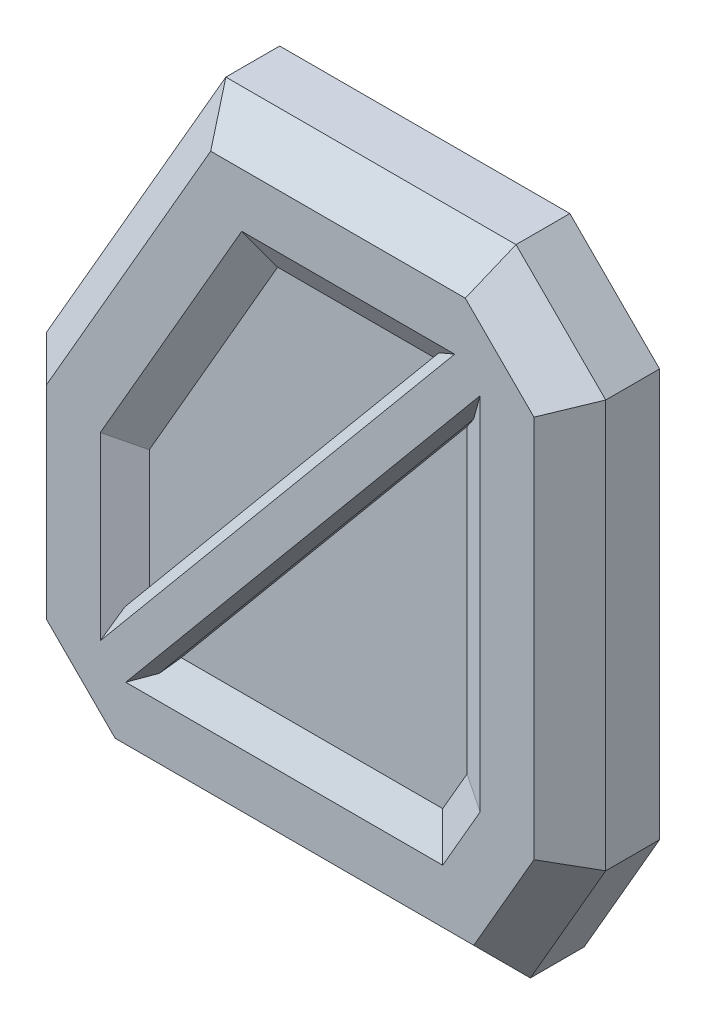
ISO-10303-21;
HEADER;
FILE_DESCRIPTION(('STEP AP214'),'2;1');
FILE_NAME('part.step','',(''),(''),'','','');
FILE_SCHEMA(('AUTOMOTIVE_DESIGN { 1 0 10303 214 1 1 1 1 }'));
ENDSEC;
DATA;
#1=APPLICATION_CONTEXT('core data for automotive mechanical design processes');
#2=APPLICATION_PROTOCOL_DEFINITION('international standard','automotive_design',2000,#1);
#3=PRODUCT_CONTEXT('',#1,'mechanical');
#4=PRODUCT('Part','Part','',(#3));
#5=PRODUCT_RELATED_PRODUCT_CATEGORY('part','',(#4));
#6=PRODUCT_DEFINITION_FORMATION('','',#4);
#7=PRODUCT_DEFINITION_CONTEXT('part definition',#1,'design');
#8=PRODUCT_DEFINITION('design','',#6,#7);
#9=PRODUCT_DEFINITION_SHAPE('','',#8);
#10=(LENGTH_UNIT() NAMED_UNIT(*) SI_UNIT(.MILLI.,.METRE.));
#11=(NAMED_UNIT(*) PLANE_ANGLE_UNIT() SI_UNIT($,.RADIAN.));
#12=(NAMED_UNIT(*) SI_UNIT($,.STERADIAN.) SOLID_ANGLE_UNIT());
#13=UNCERTAINTY_MEASURE_WITH_UNIT(LENGTH_MEASURE(1.E-05),#10,'distance_accuracy_value','');
#14=(GEOMETRIC_REPRESENTATION_CONTEXT(3) GLOBAL_UNCERTAINTY_ASSIGNED_CONTEXT((#13)) GLOBAL_UNIT_ASSIGNED_CONTEXT((#10,
#11,#12)) REPRESENTATION_CONTEXT('',''));
#15=CARTESIAN_POINT('',(0.,0.,0.));
#16=DIRECTION('',(0.,0.,1.));
#17=DIRECTION('',(1.,0.,0.));
#18=AXIS2_PLACEMENT_3D('',#15,#16,#17);
#19=CARTESIAN_POINT('',(0.,0.,0.));
#20=DIRECTION('',(0.,0.,1.));
#21=DIRECTION('',(1.,0.,0.));
#22=AXIS2_PLACEMENT_3D('',#19,#20,#21);
#23=PLANE('',#22);
#24=DIRECTION('',(-0.707106781186548,0.707106781186547,0.));
#25=VECTOR('',#24,1.);
#26=CARTESIAN_POINT('',(319.726027397261,-1.22254998857188E-13,0.));
#27=LINE('',#26,#25);
#28=CARTESIAN_POINT('',(319.726027397261,-1.22254998857188E-13,0.));
#29=VERTEX_POINT('',#28);
#30=CARTESIAN_POINT('',(269.72602739726,50.0000000000003,0.));
#31=VERTEX_POINT('',#30);
#32=EDGE_CURVE('E241',#29,#31,#27,.T.);
#33=ORIENTED_EDGE('',*,*,#32,.T.);
#34=DIRECTION('',(0.,1.,0.));
#35=VECTOR('',#34,1.);
#36=CARTESIAN_POINT('',(269.72602739726,-1.0547118733939E-12,0.));
#37=LINE('',#36,#35);
#38=CARTESIAN_POINT('',(269.72602739726,176.794919243112,0.));
#39=VERTEX_POINT('',#38);
#40=EDGE_CURVE('E230',#31,#39,#37,.T.);
#41=ORIENTED_EDGE('',*,*,#40,.T.);
#42=DIRECTION('',(0.500000000000001,0.866025403784438,0.));
#43=VECTOR('',#42,1.);
#44=CARTESIAN_POINT('',(269.72602739726,176.794919243112,0.));
#45=LINE('',#44,#43);
#46=CARTESIAN_POINT('',(369.726027397261,350.,0.));
#47=VERTEX_POINT('',#46);
#48=EDGE_CURVE('E248',#39,#47,#45,.T.);
#49=ORIENTED_EDGE('',*,*,#48,.T.);
#50=DIRECTION('',(1.,0.,0.));
#51=VECTOR('',#50,1.);
#52=CARTESIAN_POINT('',(369.726027397261,350.,0.));
#53=LINE('',#52,#51);
#54=CARTESIAN_POINT('',(531.452054794521,350.,0.));
#55=VERTEX_POINT('',#54);
#56=EDGE_CURVE('E410',#47,#55,#53,.T.);
#57=ORIENTED_EDGE('',*,*,#56,.T.);
#58=DIRECTION('',(0.707106781186547,-0.707106781186549,0.));
#59=VECTOR('',#58,1.);
#60=CARTESIAN_POINT('',(531.452054794521,350.,0.));
#61=LINE('',#60,#59);
#62=CARTESIAN_POINT('',(581.452054794521,299.999999999999,0.));
#63=VERTEX_POINT('',#62);
#64=EDGE_CURVE('E413',#55,#63,#61,.T.);
#65=ORIENTED_EDGE('',*,*,#64,.T.);
#66=DIRECTION('',(0.,-1.,0.));
#67=VECTOR('',#66,1.);
#68=CARTESIAN_POINT('',(581.452054794521,299.999999999999,0.));
#69=LINE('',#68,#67);
#70=CARTESIAN_POINT('',(581.452054794521,72.7461339178923,0.));
#71=VERTEX_POINT('',#70);
#72=EDGE_CURVE('E416',#63,#71,#69,.T.);
#73=ORIENTED_EDGE('',*,*,#72,.T.);
#74=DIRECTION('',(-0.500000000000002,-0.866025403784438,0.));
#75=VECTOR('',#74,1.);
#76=CARTESIAN_POINT('',(581.452054794521,72.7461339178923,0.));
#77=LINE('',#76,#75);
#78=CARTESIAN_POINT('',(539.45205479452,-4.72315937815432E-13,0.));
#79=VERTEX_POINT('',#78);
#80=EDGE_CURVE('E329',#71,#79,#77,.T.);
#81=ORIENTED_EDGE('',*,*,#80,.T.);
#82=DIRECTION('',(-1.,0.,0.));
#83=VECTOR('',#82,1.);
#84=CARTESIAN_POINT('',(539.45205479452,-4.72315937815432E-13,0.));
#85=LINE('',#84,#83);
#86=EDGE_CURVE('E244',#79,#29,#85,.T.);
#87=ORIENTED_EDGE('',*,*,#86,.T.);
#88=EDGE_LOOP('',(#33,#41,#49,#57,#65,#73,#81,#87));
#89=FACE_BOUND('',#88,.T.);
#90=DIRECTION('',(0.500000000000002,0.866025403784438,0.));
#91=VECTOR('',#90,1.);
#92=CARTESIAN_POINT('',(533.678552102624,9.99999999999954,0.));
#93=LINE('',#92,#91);
#94=CARTESIAN_POINT('',(533.678552102624,9.99999999999954,0.));
#95=VERTEX_POINT('',#94);
#96=CARTESIAN_POINT('',(571.452054794521,75.4256258422035,0.));
#97=VERTEX_POINT('',#96);
#98=EDGE_CURVE('E620',#95,#97,#93,.T.);
#99=ORIENTED_EDGE('',*,*,#98,.T.);
#100=DIRECTION('',(0.,1.,0.));
#101=VECTOR('',#100,1.);
#102=CARTESIAN_POINT('',(571.452054794521,75.4256258422035,0.));
#103=LINE('',#102,#101);
#104=CARTESIAN_POINT('',(571.452054794521,295.857864376268,0.));
#105=VERTEX_POINT('',#104);
#106=EDGE_CURVE('E617',#97,#105,#103,.T.);
#107=ORIENTED_EDGE('',*,*,#106,.T.);
#108=DIRECTION('',(-0.707106781186546,0.707106781186549,0.));
#109=VECTOR('',#108,1.);
#110=CARTESIAN_POINT('',(571.452054794521,295.857864376268,0.));
#111=LINE('',#110,#109);
#112=CARTESIAN_POINT('',(527.30991917079,340.,0.));
#113=VERTEX_POINT('',#112);
#114=EDGE_CURVE('E614',#105,#113,#111,.T.);
#115=ORIENTED_EDGE('',*,*,#114,.T.);
#116=DIRECTION('',(-1.,0.,0.));
#117=VECTOR('',#116,1.);
#118=CARTESIAN_POINT('',(527.30991917079,340.,0.));
#119=LINE('',#118,#117);
#120=CARTESIAN_POINT('',(375.499530089157,340.,0.));
#121=VERTEX_POINT('',#120);
#122=EDGE_CURVE('E611',#113,#121,#119,.T.);
#123=ORIENTED_EDGE('',*,*,#122,.T.);
#124=DIRECTION('',(-0.500000000000001,-0.866025403784438,0.));
#125=VECTOR('',#124,1.);
#126=CARTESIAN_POINT('',(375.499530089157,340.,0.));
#127=LINE('',#126,#125);
#128=CARTESIAN_POINT('',(279.72602739726,174.1154273188,0.));
#129=VERTEX_POINT('',#128);
#130=EDGE_CURVE('E608',#121,#129,#127,.T.);
#131=ORIENTED_EDGE('',*,*,#130,.T.);
#132=DIRECTION('',(0.,-1.,0.));
#133=VECTOR('',#132,1.);
#134=CARTESIAN_POINT('',(279.72602739726,174.1154273188,0.));
#135=LINE('',#134,#133);
#136=CARTESIAN_POINT('',(279.72602739726,54.1421356237311,0.));
#137=VERTEX_POINT('',#136);
#138=EDGE_CURVE('E605',#129,#137,#135,.T.);
#139=ORIENTED_EDGE('',*,*,#138,.T.);
#140=DIRECTION('',(0.707106781186548,-0.707106781186548,0.));
#141=VECTOR('',#140,1.);
#142=CARTESIAN_POINT('',(279.72602739726,54.1421356237311,0.));
#143=LINE('',#142,#141);
#144=CARTESIAN_POINT('',(323.868163020991,9.99999999999987,0.));
#145=VERTEX_POINT('',#144);
#146=EDGE_CURVE('E601',#137,#145,#143,.T.);
#147=ORIENTED_EDGE('',*,*,#146,.T.);
#148=DIRECTION('',(1.,0.,0.));
#149=VECTOR('',#148,1.);
#150=CARTESIAN_POINT('',(323.868163020991,9.99999999999987,0.));
#151=LINE('',#150,#149);
#152=EDGE_CURVE('E238',#145,#95,#151,.T.);
#153=ORIENTED_EDGE('',*,*,#152,.T.);
#154=EDGE_LOOP('',(#99,#107,#115,#123,#131,#139,#147,#153));
#155=FACE_BOUND('',#154,.T.);
#156=ADVANCED_FACE('F35',(#89,#155),#23,.F.);
#157=CARTESIAN_POINT('',(581.452054794521,72.7461339178923,50.));
#158=DIRECTION('',(-0.866025403784438,0.500000000000002,0.));
#159=DIRECTION('',(0.500000000000002,0.866025403784438,0.));
#160=AXIS2_PLACEMENT_3D('',#157,#158,#159);
#161=PLANE('',#160);
#162=DIRECTION('',(0.,0.,-1.));
#163=VECTOR('',#162,1.);
#164=CARTESIAN_POINT('',(539.45205479452,-4.72315937815432E-13,50.));
#165=LINE('',#164,#163);
#166=CARTESIAN_POINT('',(539.45205479452,-4.72315937815432E-13,29.9999999999999));
#167=VERTEX_POINT('',#166);
#168=EDGE_CURVE('E256',#167,#79,#165,.T.);
#169=ORIENTED_EDGE('',*,*,#168,.T.);
#170=ORIENTED_EDGE('',*,*,#80,.F.);
#171=DIRECTION('',(0.,0.,-1.));
#172=VECTOR('',#171,1.);
#173=CARTESIAN_POINT('',(581.452054794521,72.7461339178923,50.));
#174=LINE('',#173,#172);
#175=CARTESIAN_POINT('',(581.452054794521,72.7461339178923,29.9999999999999));
#176=VERTEX_POINT('',#175);
#177=EDGE_CURVE('E418',#176,#71,#174,.T.);
#178=ORIENTED_EDGE('',*,*,#177,.F.);
#179=DIRECTION('',(0.500000000000002,0.866025403784438,0.));
#180=VECTOR('',#179,1.);
#181=CARTESIAN_POINT('',(581.452054794521,72.7461339178923,29.9999999999999));
#182=LINE('',#181,#180);
#183=EDGE_CURVE('E307',#167,#176,#182,.T.);
#184=ORIENTED_EDGE('',*,*,#183,.F.);
#185=EDGE_LOOP('',(#169,#170,#178,#184));
#186=FACE_BOUND('',#185,.T.);
#187=ADVANCED_FACE('F446',(#186),#161,.F.);
#188=CARTESIAN_POINT('',(539.45205479452,-4.72315937815432E-13,50.));
#189=DIRECTION('',(0.,1.,0.));
#190=DIRECTION('',(1.,0.,0.));
#191=AXIS2_PLACEMENT_3D('',#188,#189,#190);
#192=PLANE('',#191);
#193=DIRECTION('',(0.,0.,-1.));
#194=VECTOR('',#193,1.);
#195=CARTESIAN_POINT('',(319.726027397261,-1.22254998857188E-13,50.));
#196=LINE('',#195,#194);
#197=CARTESIAN_POINT('',(319.726027397261,-1.22254998857188E-13,29.9999999999999));
#198=VERTEX_POINT('',#197);
#199=EDGE_CURVE('E254',#198,#29,#196,.T.);
#200=ORIENTED_EDGE('',*,*,#199,.T.);
#201=ORIENTED_EDGE('',*,*,#86,.F.);
#202=ORIENTED_EDGE('',*,*,#168,.F.);
#203=DIRECTION('',(1.,0.,0.));
#204=VECTOR('',#203,1.);
#205=CARTESIAN_POINT('',(539.45205479452,-4.72315937815432E-13,29.9999999999999));
#206=LINE('',#205,#204);
#207=EDGE_CURVE('E304',#198,#167,#206,.T.);
#208=ORIENTED_EDGE('',*,*,#207,.F.);
#209=EDGE_LOOP('',(#200,#201,#202,#208));
#210=FACE_BOUND('',#209,.T.);
#211=ADVANCED_FACE('F450',(#210),#192,.F.);
#212=CARTESIAN_POINT('',(319.726027397261,-1.22254998857188E-13,50.));
#213=DIRECTION('',(0.707106781186547,0.707106781186548,0.));
#214=DIRECTION('',(0.707106781186548,-0.707106781186547,0.));
#215=AXIS2_PLACEMENT_3D('',#212,#213,#214);
#216=PLANE('',#215);
#217=DIRECTION('',(0.,0.,-1.));
#218=VECTOR('',#217,1.);
#219=CARTESIAN_POINT('',(269.72602739726,50.0000000000001,50.));
#220=LINE('',#219,#218);
#221=CARTESIAN_POINT('',(269.72602739726,50.0000000000001,29.9999999999999));
#222=VERTEX_POINT('',#221);
#223=EDGE_CURVE('E49',#222,#31,#220,.T.);
#224=ORIENTED_EDGE('',*,*,#223,.T.);
#225=ORIENTED_EDGE('',*,*,#32,.F.);
#226=ORIENTED_EDGE('',*,*,#199,.F.);
#227=DIRECTION('',(0.707106781186548,-0.707106781186547,0.));
#228=VECTOR('',#227,1.);
#229=CARTESIAN_POINT('',(319.726027397261,-1.21387637119199E-13,29.9999999999999));
#230=LINE('',#229,#228);
#231=EDGE_CURVE('E253',#222,#198,#230,.T.);
#232=ORIENTED_EDGE('',*,*,#231,.F.);
#233=EDGE_LOOP('',(#224,#225,#226,#232));
#234=FACE_BOUND('',#233,.T.);
#235=ADVANCED_FACE('F251',(#234),#216,.F.);
#236=CARTESIAN_POINT('',(269.72602739726,176.794919243112,50.));
#237=DIRECTION('',(0.866025403784438,-0.500000000000001,0.));
#238=DIRECTION('',(-0.500000000000001,-0.866025403784438,0.));
#239=AXIS2_PLACEMENT_3D('',#236,#237,#238);
#240=PLANE('',#239);
#241=DIRECTION('',(0.,0.,-1.));
#242=VECTOR('',#241,1.);
#243=CARTESIAN_POINT('',(369.726027397261,350.,50.));
#244=LINE('',#243,#242);
#245=CARTESIAN_POINT('',(369.726027397261,350.,29.9999999999999));
#246=VERTEX_POINT('',#245);
#247=EDGE_CURVE('E258',#246,#47,#244,.T.);
#248=ORIENTED_EDGE('',*,*,#247,.T.);
#249=ORIENTED_EDGE('',*,*,#48,.F.);
#250=DIRECTION('',(0.,0.,-1.));
#251=VECTOR('',#250,1.);
#252=CARTESIAN_POINT('',(269.72602739726,176.794919243112,50.));
#253=LINE('',#252,#251);
#254=CARTESIAN_POINT('',(269.72602739726,176.794919243112,29.9999999999999));
#255=VERTEX_POINT('',#254);
#256=EDGE_CURVE('E234',#255,#39,#253,.T.);
#257=ORIENTED_EDGE('',*,*,#256,.F.);
#258=DIRECTION('',(-0.500000000000001,-0.866025403784438,0.));
#259=VECTOR('',#258,1.);
#260=CARTESIAN_POINT('',(269.72602739726,176.794919243112,29.9999999999999));
#261=LINE('',#260,#259);
#262=EDGE_CURVE('E297',#246,#255,#261,.T.);
#263=ORIENTED_EDGE('',*,*,#262,.F.);
#264=EDGE_LOOP('',(#248,#249,#257,#263));
#265=FACE_BOUND('',#264,.T.);
#266=ADVANCED_FACE('F430',(#265),#240,.F.);
#267=CARTESIAN_POINT('',(369.726027397261,350.,50.));
#268=DIRECTION('',(0.,-1.,0.));
#269=DIRECTION('',(0.,0.,-1.));
#270=AXIS2_PLACEMENT_3D('',#267,#268,#269);
#271=PLANE('',#270);
#272=DIRECTION('',(0.,0.,-1.));
#273=VECTOR('',#272,1.);
#274=CARTESIAN_POINT('',(531.452054794521,350.,50.));
#275=LINE('',#274,#273);
#276=CARTESIAN_POINT('',(531.452054794521,350.,29.9999999999999));
#277=VERTEX_POINT('',#276);
#278=EDGE_CURVE('E424',#277,#55,#275,.T.);
#279=ORIENTED_EDGE('',*,*,#278,.T.);
#280=ORIENTED_EDGE('',*,*,#56,.F.);
#281=ORIENTED_EDGE('',*,*,#247,.F.);
#282=DIRECTION('',(-1.,0.,0.));
#283=VECTOR('',#282,1.);
#284=CARTESIAN_POINT('',(369.726027397261,350.,29.9999999999999));
#285=LINE('',#284,#283);
#286=EDGE_CURVE('E294',#277,#246,#285,.T.);
#287=ORIENTED_EDGE('',*,*,#286,.F.);
#288=EDGE_LOOP('',(#279,#280,#281,#287));
#289=FACE_BOUND('',#288,.T.);
#290=ADVANCED_FACE('F433',(#289),#271,.F.);
#291=CARTESIAN_POINT('',(531.452054794521,350.,50.));
#292=DIRECTION('',(-0.707106781186549,-0.707106781186547,0.));
#293=DIRECTION('',(-0.707106781186547,0.707106781186549,0.));
#294=AXIS2_PLACEMENT_3D('',#291,#292,#293);
#295=PLANE('',#294);
#296=DIRECTION('',(0.,0.,-1.));
#297=VECTOR('',#296,1.);
#298=CARTESIAN_POINT('',(581.452054794521,299.999999999999,50.));
#299=LINE('',#298,#297);
#300=CARTESIAN_POINT('',(581.452054794521,299.999999999999,29.9999999999999));
#301=VERTEX_POINT('',#300);
#302=EDGE_CURVE('E421',#301,#63,#299,.T.);
#303=ORIENTED_EDGE('',*,*,#302,.T.);
#304=ORIENTED_EDGE('',*,*,#64,.F.);
#305=ORIENTED_EDGE('',*,*,#278,.F.);
#306=DIRECTION('',(-0.707106781186547,0.707106781186549,0.));
#307=VECTOR('',#306,1.);
#308=CARTESIAN_POINT('',(531.452054794521,350.,29.9999999999999));
#309=LINE('',#308,#307);
#310=EDGE_CURVE('E291',#301,#277,#309,.T.);
#311=ORIENTED_EDGE('',*,*,#310,.F.);
#312=EDGE_LOOP('',(#303,#304,#305,#311));
#313=FACE_BOUND('',#312,.T.);
#314=ADVANCED_FACE('F438',(#313),#295,.F.);
#315=CARTESIAN_POINT('',(581.452054794521,299.999999999999,50.));
#316=DIRECTION('',(-1.,0.,0.));
#317=DIRECTION('',(0.,0.,-1.));
#318=AXIS2_PLACEMENT_3D('',#315,#316,#317);
#319=PLANE('',#318);
#320=ORIENTED_EDGE('',*,*,#177,.T.);
#321=ORIENTED_EDGE('',*,*,#72,.F.);
#322=ORIENTED_EDGE('',*,*,#302,.F.);
#323=DIRECTION('',(0.,1.,0.));
#324=VECTOR('',#323,1.);
#325=CARTESIAN_POINT('',(581.452054794521,299.999999999999,29.9999999999999));
#326=LINE('',#325,#324);
#327=EDGE_CURVE('E288',#176,#301,#326,.T.);
#328=ORIENTED_EDGE('',*,*,#327,.F.);
#329=EDGE_LOOP('',(#320,#321,#322,#328));
#330=FACE_BOUND('',#329,.T.);
#331=ADVANCED_FACE('F441',(#330),#319,.F.);
#332=CARTESIAN_POINT('',(539.45205479452,-4.72347074700917E-13,50.));
#333=DIRECTION('',(0.,0.,1.));
#334=DIRECTION('',(-1.,0.,0.));
#335=AXIS2_PLACEMENT_3D('',#332,#333,#334);
#336=PLANE('',#335);
#337=DIRECTION('',(0.,-1.,0.));
#338=VECTOR('',#337,1.);
#339=CARTESIAN_POINT('',(531.452054794521,279.289321881345,50.));
#340=LINE('',#339,#338);
#341=CARTESIAN_POINT('',(531.452054794521,287.100997423057,50.));
#342=VERTEX_POINT('',#341);
#343=CARTESIAN_POINT('',(531.452054794521,86.1435935394485,50.));
#344=VERTEX_POINT('',#343);
#345=EDGE_CURVE('E363',#342,#344,#340,.T.);
#346=ORIENTED_EDGE('',*,*,#345,.T.);
#347=DIRECTION('',(-0.500000000000002,-0.866025403784438,0.));
#348=VECTOR('',#347,1.);
#349=CARTESIAN_POINT('',(531.452054794521,86.1435935394485,50.));
#350=LINE('',#349,#348);
#351=CARTESIAN_POINT('',(510.584541335039,49.9999999999996,50.));
#352=VERTEX_POINT('',#351);
#353=EDGE_CURVE('E580',#344,#352,#350,.T.);
#354=ORIENTED_EDGE('',*,*,#353,.T.);
#355=DIRECTION('',(-1.,0.,0.));
#356=VECTOR('',#355,1.);
#357=CARTESIAN_POINT('',(510.584541335039,49.9999999999996,50.));
#358=LINE('',#357,#356);
#359=CARTESIAN_POINT('',(333.928988890439,49.9999999999998,50.));
#360=VERTEX_POINT('',#359);
#361=EDGE_CURVE('E577',#352,#360,#358,.T.);
#362=ORIENTED_EDGE('',*,*,#361,.T.);
#363=DIRECTION('',(-0.640067546751165,-0.768318641968257,0.));
#364=VECTOR('',#363,1.);
#365=CARTESIAN_POINT('',(336.595112306074,53.2003377337557,50.));
#366=LINE('',#365,#364);
#367=EDGE_CURVE('E373',#342,#360,#366,.T.);
#368=ORIENTED_EDGE('',*,*,#367,.F.);
#369=EDGE_LOOP('',(#346,#354,#362,#368));
#370=FACE_BOUND('',#369,.T.);
#371=DIRECTION('',(0.,1.,0.));
#372=VECTOR('',#371,1.);
#373=CARTESIAN_POINT('',(319.72602739726,70.7106781186549,50.));
#374=LINE('',#373,#372);
#375=CARTESIAN_POINT('',(319.72602739726,62.8990025769423,50.));
#376=VERTEX_POINT('',#375);
#377=CARTESIAN_POINT('',(319.72602739726,163.397459621556,50.));
#378=VERTEX_POINT('',#377);
#379=EDGE_CURVE('E395',#376,#378,#374,.T.);
#380=ORIENTED_EDGE('',*,*,#379,.T.);
#381=DIRECTION('',(0.500000000000001,0.866025403784438,0.));
#382=VECTOR('',#381,1.);
#383=CARTESIAN_POINT('',(319.72602739726,163.397459621556,50.));
#384=LINE('',#383,#382);
#385=CARTESIAN_POINT('',(398.593540856742,300.,50.));
#386=VERTEX_POINT('',#385);
#387=EDGE_CURVE('E400',#378,#386,#384,.T.);
#388=ORIENTED_EDGE('',*,*,#387,.T.);
#389=DIRECTION('',(1.,0.,0.));
#390=VECTOR('',#389,1.);
#391=CARTESIAN_POINT('',(398.593540856742,300.,50.));
#392=LINE('',#391,#390);
#393=CARTESIAN_POINT('',(517.249093301342,300.,50.));
#394=VERTEX_POINT('',#393);
#395=EDGE_CURVE('E397',#386,#394,#392,.T.);
#396=ORIENTED_EDGE('',*,*,#395,.T.);
#397=DIRECTION('',(0.640067546751165,0.768318641968257,0.));
#398=VECTOR('',#397,1.);
#399=CARTESIAN_POINT('',(514.582969885707,296.799662266244,50.));
#400=LINE('',#399,#398);
#401=EDGE_CURVE('E370',#376,#394,#400,.T.);
#402=ORIENTED_EDGE('',*,*,#401,.F.);
#403=EDGE_LOOP('',(#380,#388,#396,#402));
#404=FACE_BOUND('',#403,.T.);
#405=DIRECTION('',(0.707106781186547,-0.707106781186549,0.));
#406=VECTOR('',#405,1.);
#407=CARTESIAN_POINT('',(567.30991917079,285.857864376268,50.));
#408=LINE('',#407,#406);
#409=CARTESIAN_POINT('',(523.167783547059,330.,50.));
#410=VERTEX_POINT('',#409);
#411=CARTESIAN_POINT('',(561.452054794521,291.715728752537,50.));
#412=VERTEX_POINT('',#411);
#413=EDGE_CURVE('E282',#410,#412,#408,.T.);
#414=ORIENTED_EDGE('',*,*,#413,.F.);
#415=DIRECTION('',(1.,0.,0.));
#416=VECTOR('',#415,1.);
#417=CARTESIAN_POINT('',(531.452054794521,330.,50.));
#418=LINE('',#417,#416);
#419=CARTESIAN_POINT('',(381.273032781054,330.,50.));
#420=VERTEX_POINT('',#419);
#421=EDGE_CURVE('E279',#420,#410,#418,.T.);
#422=ORIENTED_EDGE('',*,*,#421,.F.);
#423=DIRECTION('',(0.500000000000001,0.866025403784438,0.));
#424=VECTOR('',#423,1.);
#425=CARTESIAN_POINT('',(387.04653547295,340.,50.));
#426=LINE('',#425,#424);
#427=CARTESIAN_POINT('',(289.72602739726,171.435935394489,50.));
#428=VERTEX_POINT('',#427);
#429=EDGE_CURVE('E276',#428,#420,#426,.T.);
#430=ORIENTED_EDGE('',*,*,#429,.F.);
#431=DIRECTION('',(0.,1.,0.));
#432=VECTOR('',#431,1.);
#433=CARTESIAN_POINT('',(289.72602739726,176.794919243112,50.));
#434=LINE('',#433,#432);
#435=CARTESIAN_POINT('',(289.72602739726,58.284271247462,50.));
#436=VERTEX_POINT('',#435);
#437=EDGE_CURVE('E273',#436,#428,#434,.T.);
#438=ORIENTED_EDGE('',*,*,#437,.F.);
#439=DIRECTION('',(-0.707106781186548,0.707106781186547,0.));
#440=VECTOR('',#439,1.);
#441=CARTESIAN_POINT('',(283.868163020991,64.1421356237311,50.));
#442=LINE('',#441,#440);
#443=CARTESIAN_POINT('',(328.010298644722,19.9999999999998,50.));
#444=VERTEX_POINT('',#443);
#445=EDGE_CURVE('E270',#444,#436,#442,.T.);
#446=ORIENTED_EDGE('',*,*,#445,.F.);
#447=DIRECTION('',(-1.,0.,0.));
#448=VECTOR('',#447,1.);
#449=CARTESIAN_POINT('',(319.726027397261,19.9999999999999,50.));
#450=LINE('',#449,#448);
#451=CARTESIAN_POINT('',(527.905049410728,19.9999999999995,50.));
#452=VERTEX_POINT('',#451);
#453=EDGE_CURVE('E267',#452,#444,#450,.T.);
#454=ORIENTED_EDGE('',*,*,#453,.F.);
#455=DIRECTION('',(-0.500000000000002,-0.866025403784438,0.));
#456=VECTOR('',#455,1.);
#457=CARTESIAN_POINT('',(522.131546718832,9.99999999999955,50.));
#458=LINE('',#457,#456);
#459=CARTESIAN_POINT('',(561.452054794521,78.1051177665148,50.));
#460=VERTEX_POINT('',#459);
#461=EDGE_CURVE('E264',#460,#452,#458,.T.);
#462=ORIENTED_EDGE('',*,*,#461,.F.);
#463=DIRECTION('',(0.,-1.,0.));
#464=VECTOR('',#463,1.);
#465=CARTESIAN_POINT('',(561.452054794521,72.7461339178923,50.));
#466=LINE('',#465,#464);
#467=EDGE_CURVE('E285',#412,#460,#466,.T.);
#468=ORIENTED_EDGE('',*,*,#467,.F.);
#469=EDGE_LOOP('',(#414,#422,#430,#438,#446,#454,#462,#468));
#470=FACE_BOUND('',#469,.T.);
#471=ADVANCED_FACE('F392',(#370,#404,#470),#336,.T.);
#472=CARTESIAN_POINT('',(289.72602739726,-2.53685643217989E-13,50.));
#473=DIRECTION('',(-0.707106781186549,0.,0.707106781186546));
#474=DIRECTION('',(0.,-1.,0.));
#475=AXIS2_PLACEMENT_3D('',#472,#473,#474);
#476=PLANE('',#475);
#477=DIRECTION('',(0.678598344545846,0.281084637714819,0.678598344545848));
#478=VECTOR('',#477,1.);
#479=CARTESIAN_POINT('',(331.269246520036,75.492036032753,91.5432191227761));
#480=LINE('',#479,#478);
#481=EDGE_CURVE('E324',#222,#436,#480,.T.);
#482=ORIENTED_EDGE('',*,*,#481,.T.);
#483=ORIENTED_EDGE('',*,*,#437,.T.);
#484=DIRECTION('',(0.694746590606865,-0.186156787897384,0.694746590606867));
#485=VECTOR('',#484,1.);
#486=CARTESIAN_POINT('',(311.898144428187,165.494934541564,72.1721170309266));
#487=LINE('',#486,#485);
#488=EDGE_CURVE('E326',#428,#255,#487,.F.);
#489=ORIENTED_EDGE('',*,*,#488,.T.);
#490=DIRECTION('',(0.,-1.,0.));
#491=VECTOR('',#490,1.);
#492=CARTESIAN_POINT('',(269.72602739726,50.0000000000001,29.9999999999999));
#493=LINE('',#492,#491);
#494=EDGE_CURVE('E300',#255,#222,#493,.T.);
#495=ORIENTED_EDGE('',*,*,#494,.T.);
#496=EDGE_LOOP('',(#482,#483,#489,#495));
#497=FACE_BOUND('',#496,.T.);
#498=ADVANCED_FACE('F459',(#497),#476,.T.);
#499=CARTESIAN_POINT('',(277.923596659988,150.99352570472,50.));
#500=DIRECTION('',(-0.612372435695795,0.353553390593276,0.707106781186546));
#501=DIRECTION('',(-0.500000000000001,-0.866025403784438,0.));
#502=AXIS2_PLACEMENT_3D('',#499,#500,#501);
#503=PLANE('',#502);
#504=ORIENTED_EDGE('',*,*,#488,.F.);
#505=ORIENTED_EDGE('',*,*,#429,.T.);
#506=DIRECTION('',(0.377964473009225,-0.654653670707976,0.654653670707979));
#507=VECTOR('',#506,1.);
#508=CARTESIAN_POINT('',(410.801443101358,278.855293058492,101.144706941509));
#509=LINE('',#508,#507);
#510=EDGE_CURVE('E322',#420,#246,#509,.F.);
#511=ORIENTED_EDGE('',*,*,#510,.T.);
#512=ORIENTED_EDGE('',*,*,#262,.T.);
#513=EDGE_LOOP('',(#504,#505,#511,#512));
#514=FACE_BOUND('',#513,.T.);
#515=ADVANCED_FACE('F462',(#514),#503,.T.);
#516=CARTESIAN_POINT('',(443.731176719622,-95.7208780748993,50.));
#517=DIRECTION('',(-0.500000000000001,-0.500000000000001,0.707106781186546));
#518=DIRECTION('',(0.707106781186548,-0.707106781186547,0.));
#519=AXIS2_PLACEMENT_3D('',#516,#517,#518);
#520=PLANE('',#519);
#521=ORIENTED_EDGE('',*,*,#481,.F.);
#522=ORIENTED_EDGE('',*,*,#231,.T.);
#523=DIRECTION('',(0.28108463771482,0.678598344545845,0.678598344545849));
#524=VECTOR('',#523,1.);
#525=CARTESIAN_POINT('',(344.716010188985,60.3311553792519,90.3311553792522));
#526=LINE('',#525,#524);
#527=EDGE_CURVE('E320',#198,#444,#526,.T.);
#528=ORIENTED_EDGE('',*,*,#527,.T.);
#529=ORIENTED_EDGE('',*,*,#445,.T.);
#530=EDGE_LOOP('',(#521,#522,#528,#529));
#531=FACE_BOUND('',#530,.T.);
#532=ADVANCED_FACE('F456',(#531),#520,.T.);
#533=CARTESIAN_POINT('',(539.452054794521,330.,50.));
#534=DIRECTION('',(0.,0.707106781186549,0.707106781186545));
#535=DIRECTION('',(-1.,0.,0.));
#536=AXIS2_PLACEMENT_3D('',#533,#534,#535);
#537=PLANE('',#536);
#538=ORIENTED_EDGE('',*,*,#510,.F.);
#539=ORIENTED_EDGE('',*,*,#421,.T.);
#540=DIRECTION('',(-0.281084637714821,-0.678598344545845,0.678598344545849));
#541=VECTOR('',#540,1.);
#542=CARTESIAN_POINT('',(524.454380589773,333.106120029829,46.8938799701702));
#543=LINE('',#542,#541);
#544=EDGE_CURVE('E318',#410,#277,#543,.F.);
#545=ORIENTED_EDGE('',*,*,#544,.T.);
#546=ORIENTED_EDGE('',*,*,#286,.T.);
#547=EDGE_LOOP('',(#538,#539,#545,#546));
#548=FACE_BOUND('',#547,.T.);
#549=ADVANCED_FACE('F465',(#548),#537,.T.);
#550=CARTESIAN_POINT('',(539.45205479452,19.9999999999995,50.));
#551=DIRECTION('',(0.,-0.707106781186549,0.707106781186546));
#552=DIRECTION('',(1.,0.,0.));
#553=AXIS2_PLACEMENT_3D('',#550,#551,#552);
#554=PLANE('',#553);
#555=ORIENTED_EDGE('',*,*,#527,.F.);
#556=ORIENTED_EDGE('',*,*,#207,.T.);
#557=DIRECTION('',(-0.377964473009225,0.654653670707977,0.654653670707979));
#558=VECTOR('',#557,1.);
#559=CARTESIAN_POINT('',(529.554621608413,17.1428571428567,47.1428571428571));
#560=LINE('',#559,#558);
#561=EDGE_CURVE('E316',#167,#452,#560,.T.);
#562=ORIENTED_EDGE('',*,*,#561,.T.);
#563=ORIENTED_EDGE('',*,*,#453,.T.);
#564=EDGE_LOOP('',(#555,#556,#562,#563));
#565=FACE_BOUND('',#564,.T.);
#566=ADVANCED_FACE('F452',(#565),#554,.T.);
#567=CARTESIAN_POINT('',(696.30991917079,156.857864376268,50.));
#568=DIRECTION('',(0.500000000000002,0.5,0.707106781186546));
#569=DIRECTION('',(-0.707106781186547,0.707106781186549,0.));
#570=AXIS2_PLACEMENT_3D('',#567,#568,#569);
#571=PLANE('',#570);
#572=ORIENTED_EDGE('',*,*,#544,.F.);
#573=ORIENTED_EDGE('',*,*,#413,.T.);
#574=DIRECTION('',(-0.678598344545846,-0.281084637714818,0.678598344545849));
#575=VECTOR('',#574,1.);
#576=CARTESIAN_POINT('',(597.830252762993,306.784071725772,13.621802031528));
#577=LINE('',#576,#575);
#578=EDGE_CURVE('E313',#412,#301,#577,.F.);
#579=ORIENTED_EDGE('',*,*,#578,.T.);
#580=ORIENTED_EDGE('',*,*,#310,.T.);
#581=EDGE_LOOP('',(#572,#573,#579,#580));
#582=FACE_BOUND('',#581,.T.);
#583=ADVANCED_FACE('F468',(#582),#571,.T.);
#584=CARTESIAN_POINT('',(522.131546718832,9.99999999999955,50.));
#585=DIRECTION('',(0.612372435695795,-0.353553390593276,0.707106781186546));
#586=DIRECTION('',(0.500000000000002,0.866025403784438,0.));
#587=AXIS2_PLACEMENT_3D('',#584,#585,#586);
#588=PLANE('',#587);
#589=ORIENTED_EDGE('',*,*,#561,.F.);
#590=ORIENTED_EDGE('',*,*,#183,.T.);
#591=DIRECTION('',(0.694746590606864,-0.186156787897386,-0.694746590606868));
#592=VECTOR('',#591,1.);
#593=CARTESIAN_POINT('',(551.281271116483,80.8303710394366,60.1707836780375));
#594=LINE('',#593,#592);
#595=EDGE_CURVE('E311',#176,#460,#594,.F.);
#596=ORIENTED_EDGE('',*,*,#595,.T.);
#597=ORIENTED_EDGE('',*,*,#461,.T.);
#598=EDGE_LOOP('',(#589,#590,#596,#597));
#599=FACE_BOUND('',#598,.T.);
#600=ADVANCED_FACE('F474',(#599),#588,.T.);
#601=CARTESIAN_POINT('',(561.45205479452,-5.10873707609484E-13,50.));
#602=DIRECTION('',(0.707106781186549,0.,0.707106781186546));
#603=DIRECTION('',(0.,1.,0.));
#604=AXIS2_PLACEMENT_3D('',#601,#602,#603);
#605=PLANE('',#604);
#606=ORIENTED_EDGE('',*,*,#578,.F.);
#607=ORIENTED_EDGE('',*,*,#467,.T.);
#608=ORIENTED_EDGE('',*,*,#595,.F.);
#609=ORIENTED_EDGE('',*,*,#327,.T.);
#610=EDGE_LOOP('',(#606,#607,#608,#609));
#611=FACE_BOUND('',#610,.T.);
#612=ADVANCED_FACE('F471',(#611),#605,.T.);
#613=CARTESIAN_POINT('',(510.741376675866,300.,40.));
#614=DIRECTION('',(0.768318641968257,-0.640067546751164,0.));
#615=DIRECTION('',(-0.640067546751164,-0.768318641968257,0.));
#616=AXIS2_PLACEMENT_3D('',#613,#614,#615);
#617=PLANE('',#616);
#618=DIRECTION('',(-0.585086728250878,-0.702321251507112,-0.40548536361522));
#619=VECTOR('',#618,1.);
#620=CARTESIAN_POINT('',(511.080037852395,300.40651911905,50.2347039228147));
#621=LINE('',#620,#619);
#622=CARTESIAN_POINT('',(496.312083272169,282.679491924311,40.));
#623=VERTEX_POINT('',#622);
#624=CARTESIAN_POINT('',(503.526729974017,291.339745962155,45.));
#625=VERTEX_POINT('',#624);
#626=EDGE_CURVE('E337',#623,#625,#621,.F.);
#627=ORIENTED_EDGE('',*,*,#626,.F.);
#628=DIRECTION('',(-0.640067546751164,-0.768318641968256,0.));
#629=VECTOR('',#628,1.);
#630=CARTESIAN_POINT('',(510.741376675866,300.,40.));
#631=LINE('',#630,#629);
#632=CARTESIAN_POINT('',(337.046535472949,91.5017169870687,40.));
#633=VERTEX_POINT('',#632);
#634=EDGE_CURVE('E314',#623,#633,#631,.T.);
#635=ORIENTED_EDGE('',*,*,#634,.T.);
#636=DIRECTION('',(-0.600384141595211,-0.720683825747912,0.346631945767171));
#637=VECTOR('',#636,1.);
#638=CARTESIAN_POINT('',(297.454919237111,43.9770815418761,62.8582302914132));
#639=LINE('',#638,#637);
#640=CARTESIAN_POINT('',(328.386281435105,81.1061975528616,45.));
#641=VERTEX_POINT('',#640);
#642=EDGE_CURVE('E340',#641,#633,#639,.F.);
#643=ORIENTED_EDGE('',*,*,#642,.F.);
#644=DIRECTION('',(-0.640067546751164,-0.768318641968257,0.));
#645=VECTOR('',#644,1.);
#646=CARTESIAN_POINT('',(319.72602739726,70.7106781186549,45.));
#647=LINE('',#646,#645);
#648=EDGE_CURVE('E376',#625,#641,#647,.T.);
#649=ORIENTED_EDGE('',*,*,#648,.F.);
#650=EDGE_LOOP('',(#627,#635,#643,#649));
#651=FACE_BOUND('',#650,.T.);
#652=ADVANCED_FACE('F502',(#651),#617,.F.);
#653=CARTESIAN_POINT('',(539.45205479452,-4.72347074700917E-13,40.));
#654=DIRECTION('',(0.,0.,-1.));
#655=DIRECTION('',(1.,0.,0.));
#656=AXIS2_PLACEMENT_3D('',#653,#654,#655);
#657=PLANE('',#656);
#658=ORIENTED_EDGE('',*,*,#634,.F.);
#659=DIRECTION('',(1.,0.,0.));
#660=VECTOR('',#659,1.);
#661=CARTESIAN_POINT('',(510.741376675866,282.679491924311,40.));
#662=LINE('',#661,#660);
#663=CARTESIAN_POINT('',(408.593540856742,282.679491924311,40.));
#664=VERTEX_POINT('',#663);
#665=EDGE_CURVE('E310',#664,#623,#662,.T.);
#666=ORIENTED_EDGE('',*,*,#665,.F.);
#667=DIRECTION('',(0.500000000000001,0.866025403784438,0.));
#668=VECTOR('',#667,1.);
#669=CARTESIAN_POINT('',(413.593540856742,291.339745962155,40.));
#670=LINE('',#669,#668);
#671=CARTESIAN_POINT('',(337.046535472949,158.756443470178,40.));
#672=VERTEX_POINT('',#671);
#673=EDGE_CURVE('E331',#672,#664,#670,.T.);
#674=ORIENTED_EDGE('',*,*,#673,.F.);
#675=DIRECTION('',(0.,1.,0.));
#676=VECTOR('',#675,1.);
#677=CARTESIAN_POINT('',(337.046535472949,163.397459621556,40.));
#678=LINE('',#677,#676);
#679=EDGE_CURVE('E334',#633,#672,#678,.T.);
#680=ORIENTED_EDGE('',*,*,#679,.F.);
#681=EDGE_LOOP('',(#658,#666,#674,#680));
#682=FACE_BOUND('',#681,.T.);
#683=ADVANCED_FACE('F563',(#682),#657,.F.);
#684=CARTESIAN_POINT('',(340.436705515915,49.9999999999998,40.));
#685=DIRECTION('',(-0.768318641968257,0.640067546751164,0.));
#686=DIRECTION('',(0.640067546751164,0.768318641968257,0.));
#687=AXIS2_PLACEMENT_3D('',#684,#685,#686);
#688=PLANE('',#687);
#689=DIRECTION('',(-0.585086728250877,-0.702321251507112,0.405485363615221));
#690=VECTOR('',#689,1.);
#691=CARTESIAN_POINT('',(418.054693605962,143.170396631337,-3.79195357560622));
#692=LINE('',#691,#690);
#693=CARTESIAN_POINT('',(354.865998919612,67.3205080756887,40.));
#694=VERTEX_POINT('',#693);
#695=CARTESIAN_POINT('',(347.651352217764,58.6602540378443,45.));
#696=VERTEX_POINT('',#695);
#697=EDGE_CURVE('E354',#694,#696,#692,.T.);
#698=ORIENTED_EDGE('',*,*,#697,.F.);
#699=DIRECTION('',(0.640067546751164,0.768318641968256,0.));
#700=VECTOR('',#699,1.);
#701=CARTESIAN_POINT('',(340.436705515915,49.9999999999998,40.));
#702=LINE('',#701,#700);
#703=CARTESIAN_POINT('',(514.131546718832,258.498283012931,40.));
#704=VERTEX_POINT('',#703);
#705=EDGE_CURVE('E403',#694,#704,#702,.T.);
#706=ORIENTED_EDGE('',*,*,#705,.T.);
#707=DIRECTION('',(-0.60038414159521,-0.720683825747912,-0.346631945767172));
#708=VECTOR('',#707,1.);
#709=CARTESIAN_POINT('',(402.282663925546,124.238106614997,-24.5759825892618));
#710=LINE('',#709,#708);
#711=CARTESIAN_POINT('',(522.791800756676,268.893802447138,45.));
#712=VERTEX_POINT('',#711);
#713=EDGE_CURVE('E351',#712,#704,#710,.T.);
#714=ORIENTED_EDGE('',*,*,#713,.F.);
#715=DIRECTION('',(0.640067546751164,0.768318641968257,0.));
#716=VECTOR('',#715,1.);
#717=CARTESIAN_POINT('',(531.452054794521,279.289321881345,45.));
#718=LINE('',#717,#716);
#719=EDGE_CURVE('E357',#696,#712,#718,.T.);
#720=ORIENTED_EDGE('',*,*,#719,.F.);
#721=EDGE_LOOP('',(#698,#706,#714,#720));
#722=FACE_BOUND('',#721,.T.);
#723=ADVANCED_FACE('F559',(#722),#688,.F.);
#724=CARTESIAN_POINT('',(539.45205479452,-4.72347074700917E-13,40.));
#725=DIRECTION('',(0.,0.,1.));
#726=DIRECTION('',(-1.,0.,0.));
#727=AXIS2_PLACEMENT_3D('',#724,#725,#726);
#728=PLANE('',#727);
#729=DIRECTION('',(-0.500000000000002,-0.866025403784438,0.));
#730=VECTOR('',#729,1.);
#731=CARTESIAN_POINT('',(481.150784605298,33.6602540378441,40.));
#732=LINE('',#731,#730);
#733=CARTESIAN_POINT('',(514.131546718832,90.7846096908261,40.));
#734=VERTEX_POINT('',#733);
#735=CARTESIAN_POINT('',(500.584541335039,67.3205080756885,40.));
#736=VERTEX_POINT('',#735);
#737=EDGE_CURVE('E346',#734,#736,#732,.T.);
#738=ORIENTED_EDGE('',*,*,#737,.F.);
#739=DIRECTION('',(0.,-1.,0.));
#740=VECTOR('',#739,1.);
#741=CARTESIAN_POINT('',(514.131546718831,-4.29370018049844E-13,40.));
#742=LINE('',#741,#740);
#743=EDGE_CURVE('E343',#704,#734,#742,.T.);
#744=ORIENTED_EDGE('',*,*,#743,.F.);
#745=ORIENTED_EDGE('',*,*,#705,.F.);
#746=DIRECTION('',(-1.,0.,0.));
#747=VECTOR('',#746,1.);
#748=CARTESIAN_POINT('',(539.452054794521,67.3205080756885,40.));
#749=LINE('',#748,#747);
#750=EDGE_CURVE('E349',#736,#694,#749,.T.);
#751=ORIENTED_EDGE('',*,*,#750,.F.);
#752=EDGE_LOOP('',(#738,#744,#745,#751));
#753=FACE_BOUND('',#752,.T.);
#754=ADVANCED_FACE('F524',(#753),#728,.T.);
#755=CARTESIAN_POINT('',(539.452054794521,282.679491924311,40.));
#756=DIRECTION('',(0.,-0.499999999999994,0.866025403784442));
#757=DIRECTION('',(-1.,0.,0.));
#758=AXIS2_PLACEMENT_3D('',#755,#756,#757);
#759=PLANE('',#758);
#760=ORIENTED_EDGE('',*,*,#626,.T.);
#761=DIRECTION('',(0.808172634835629,0.510041904383483,0.294472830793789));
#762=VECTOR('',#761,1.);
#763=CARTESIAN_POINT('',(522.231407008776,303.14436379313,51.8153992823937));
#764=LINE('',#763,#762);
#765=EDGE_CURVE('E11',#394,#625,#764,.F.);
#766=ORIENTED_EDGE('',*,*,#765,.F.);
#767=ORIENTED_EDGE('',*,*,#395,.F.);
#768=DIRECTION('',(-0.447213595499959,0.774596669241486,0.447213595499952));
#769=VECTOR('',#768,1.);
#770=CARTESIAN_POINT('',(444.469213690031,220.541003821336,4.12432716671195));
#771=LINE('',#770,#769);
#772=EDGE_CURVE('E360',#386,#664,#771,.F.);
#773=ORIENTED_EDGE('',*,*,#772,.T.);
#774=ORIENTED_EDGE('',*,*,#665,.T.);
#775=EDGE_LOOP('',(#760,#766,#767,#773,#774));
#776=FACE_BOUND('',#775,.T.);
#777=ADVANCED_FACE('F520',(#776),#759,.T.);
#778=CARTESIAN_POINT('',(318.904358773521,127.333271666876,40.));
#779=DIRECTION('',(0.433012701892213,-0.249999999999998,0.866025403784442));
#780=DIRECTION('',(-0.500000000000001,-0.866025403784438,0.));
#781=AXIS2_PLACEMENT_3D('',#778,#779,#780);
#782=PLANE('',#781);
#783=ORIENTED_EDGE('',*,*,#772,.F.);
#784=ORIENTED_EDGE('',*,*,#387,.F.);
#785=DIRECTION('',(-0.843610022961953,0.226044624379459,0.487058473848142));
#786=VECTOR('',#785,1.);
#787=CARTESIAN_POINT('',(367.320359034554,150.644596895044,22.5213998173086));
#788=LINE('',#787,#786);
#789=EDGE_CURVE('E358',#378,#672,#788,.F.);
#790=ORIENTED_EDGE('',*,*,#789,.T.);
#791=ORIENTED_EDGE('',*,*,#673,.T.);
#792=EDGE_LOOP('',(#783,#784,#790,#791));
#793=FACE_BOUND('',#792,.T.);
#794=ADVANCED_FACE('F517',(#793),#782,.T.);
#795=CARTESIAN_POINT('',(337.046535472949,-3.60338250052343E-13,40.));
#796=DIRECTION('',(0.499999999999994,0.,0.866025403784442));
#797=DIRECTION('',(0.,-1.,0.));
#798=AXIS2_PLACEMENT_3D('',#795,#796,#797);
#799=PLANE('',#798);
#800=ORIENTED_EDGE('',*,*,#642,.T.);
#801=ORIENTED_EDGE('',*,*,#679,.T.);
#802=ORIENTED_EDGE('',*,*,#789,.F.);
#803=ORIENTED_EDGE('',*,*,#379,.F.);
#804=DIRECTION('',(0.416907061233562,0.876499478831256,-0.240701404030248));
#805=VECTOR('',#804,1.);
#806=CARTESIAN_POINT('',(300.755552576956,23.0157459969748,60.9526087441576));
#807=LINE('',#806,#805);
#808=EDGE_CURVE('E42',#641,#376,#807,.F.);
#809=ORIENTED_EDGE('',*,*,#808,.F.);
#810=EDGE_LOOP('',(#800,#801,#802,#803,#809));
#811=FACE_BOUND('',#810,.T.);
#812=ADVANCED_FACE('F398',(#811),#799,.T.);
#813=CARTESIAN_POINT('',(514.131546718831,-4.29370018049844E-13,40.));
#814=DIRECTION('',(0.499999999999995,0.,-0.866025403784441));
#815=DIRECTION('',(0.,-1.,0.));
#816=AXIS2_PLACEMENT_3D('',#813,#814,#815);
#817=PLANE('',#816);
#818=ORIENTED_EDGE('',*,*,#713,.T.);
#819=ORIENTED_EDGE('',*,*,#743,.T.);
#820=DIRECTION('',(-0.843610022961953,0.226044624379458,-0.487058473848144));
#821=VECTOR('',#820,1.);
#822=CARTESIAN_POINT('',(501.553112088682,94.1549910920225,32.737837380299));
#823=LINE('',#822,#821);
#824=EDGE_CURVE('E361',#734,#344,#823,.F.);
#825=ORIENTED_EDGE('',*,*,#824,.T.);
#826=ORIENTED_EDGE('',*,*,#345,.F.);
#827=DIRECTION('',(0.416907061233561,0.876499478831256,0.240701404030248));
#828=VECTOR('',#827,1.);
#829=CARTESIAN_POINT('',(422.525941952525,58.0962862660122,-12.8885205711049));
#830=LINE('',#829,#828);
#831=EDGE_CURVE('E379',#712,#342,#830,.T.);
#832=ORIENTED_EDGE('',*,*,#831,.F.);
#833=EDGE_LOOP('',(#818,#819,#825,#826,#832));
#834=FACE_BOUND('',#833,.T.);
#835=ADVANCED_FACE('F516',(#834),#817,.F.);
#836=CARTESIAN_POINT('',(481.150784605298,33.6602540378441,40.));
#837=DIRECTION('',(0.433012701892214,-0.249999999999998,-0.866025403784442));
#838=DIRECTION('',(-0.500000000000002,-0.866025403784438,0.));
#839=AXIS2_PLACEMENT_3D('',#836,#837,#838);
#840=PLANE('',#839);
#841=ORIENTED_EDGE('',*,*,#824,.F.);
#842=ORIENTED_EDGE('',*,*,#737,.T.);
#843=DIRECTION('',(-0.447213595499958,0.774596669241486,-0.447213595499953));
#844=VECTOR('',#843,1.);
#845=CARTESIAN_POINT('',(508.358044026935,53.8564064605507,47.7735026918962));
#846=LINE('',#845,#844);
#847=EDGE_CURVE('E364',#736,#352,#846,.F.);
#848=ORIENTED_EDGE('',*,*,#847,.T.);
#849=ORIENTED_EDGE('',*,*,#353,.F.);
#850=EDGE_LOOP('',(#841,#842,#848,#849));
#851=FACE_BOUND('',#850,.T.);
#852=ADVANCED_FACE('F530',(#851),#840,.F.);
#853=CARTESIAN_POINT('',(539.452054794521,67.3205080756885,40.));
#854=DIRECTION('',(0.,-0.499999999999995,-0.866025403784441));
#855=DIRECTION('',(-1.,0.,0.));
#856=AXIS2_PLACEMENT_3D('',#853,#854,#855);
#857=PLANE('',#856);
#858=ORIENTED_EDGE('',*,*,#847,.F.);
#859=ORIENTED_EDGE('',*,*,#750,.T.);
#860=ORIENTED_EDGE('',*,*,#697,.T.);
#861=DIRECTION('',(0.80817263483563,0.510041904383481,-0.294472830793789));
#862=VECTOR('',#861,1.);
#863=CARTESIAN_POINT('',(477.684337648178,140.724739598021,-2.37995282907543));
#864=LINE('',#863,#862);
#865=EDGE_CURVE('E381',#360,#696,#864,.T.);
#866=ORIENTED_EDGE('',*,*,#865,.F.);
#867=ORIENTED_EDGE('',*,*,#361,.F.);
#868=EDGE_LOOP('',(#858,#859,#860,#866,#867));
#869=FACE_BOUND('',#868,.T.);
#870=ADVANCED_FACE('F526',(#869),#857,.F.);
#871=CARTESIAN_POINT('',(340.436705515915,49.9999999999998,45.));
#872=DIRECTION('',(0.543283321847791,-0.452596102725184,0.70710678118655));
#873=DIRECTION('',(-0.640067546751164,-0.768318641968257,0.));
#874=AXIS2_PLACEMENT_3D('',#871,#872,#873);
#875=PLANE('',#874);
#876=ORIENTED_EDGE('',*,*,#865,.T.);
#877=ORIENTED_EDGE('',*,*,#719,.T.);
#878=ORIENTED_EDGE('',*,*,#831,.T.);
#879=ORIENTED_EDGE('',*,*,#367,.T.);
#880=EDGE_LOOP('',(#876,#877,#878,#879));
#881=FACE_BOUND('',#880,.T.);
#882=ADVANCED_FACE('F529',(#881),#875,.T.);
#883=CARTESIAN_POINT('',(510.741376675866,300.,45.));
#884=DIRECTION('',(-0.543283321847793,0.452596102725185,0.707106781186549));
#885=DIRECTION('',(0.640067546751164,0.768318641968257,0.));
#886=AXIS2_PLACEMENT_3D('',#883,#884,#885);
#887=PLANE('',#886);
#888=ORIENTED_EDGE('',*,*,#765,.T.);
#889=ORIENTED_EDGE('',*,*,#648,.T.);
#890=ORIENTED_EDGE('',*,*,#808,.T.);
#891=ORIENTED_EDGE('',*,*,#401,.T.);
#892=EDGE_LOOP('',(#888,#889,#890,#891));
#893=FACE_BOUND('',#892,.T.);
#894=ADVANCED_FACE('F384',(#893),#887,.T.);
#895=CARTESIAN_POINT('',(323.868163020991,9.99999999999987,30.));
#896=DIRECTION('',(0.,-1.,0.));
#897=DIRECTION('',(-1.,0.,0.));
#898=AXIS2_PLACEMENT_3D('',#895,#896,#897);
#899=PLANE('',#898);
#900=ORIENTED_EDGE('',*,*,#152,.F.);
#901=DIRECTION('',(0.,0.,-1.));
#902=VECTOR('',#901,1.);
#903=CARTESIAN_POINT('',(323.868163020991,9.99999999999987,30.));
#904=LINE('',#903,#902);
#905=CARTESIAN_POINT('',(323.868163020991,9.99999999999987,30.));
#906=VERTEX_POINT('',#905);
#907=EDGE_CURVE('E366',#906,#145,#904,.T.);
#908=ORIENTED_EDGE('',*,*,#907,.F.);
#909=DIRECTION('',(1.,0.,0.));
#910=VECTOR('',#909,1.);
#911=CARTESIAN_POINT('',(323.868163020991,9.99999999999987,30.));
#912=LINE('',#911,#910);
#913=CARTESIAN_POINT('',(533.678552102624,9.99999999999954,30.));
#914=VERTEX_POINT('',#913);
#915=EDGE_CURVE('E604',#906,#914,#912,.T.);
#916=ORIENTED_EDGE('',*,*,#915,.T.);
#917=DIRECTION('',(0.,0.,-1.));
#918=VECTOR('',#917,1.);
#919=CARTESIAN_POINT('',(533.678552102624,9.99999999999954,30.));
#920=LINE('',#919,#918);
#921=EDGE_CURVE('E57',#914,#95,#920,.T.);
#922=ORIENTED_EDGE('',*,*,#921,.T.);
#923=EDGE_LOOP('',(#900,#908,#916,#922));
#924=FACE_BOUND('',#923,.T.);
#925=ADVANCED_FACE('F541',(#924),#899,.F.);
#926=CARTESIAN_POINT('',(279.72602739726,54.1421356237311,30.));
#927=DIRECTION('',(-0.707106781186548,-0.707106781186548,0.));
#928=DIRECTION('',(-0.707106781186548,0.707106781186548,0.));
#929=AXIS2_PLACEMENT_3D('',#926,#927,#928);
#930=PLANE('',#929);
#931=ORIENTED_EDGE('',*,*,#146,.F.);
#932=DIRECTION('',(0.,0.,-1.));
#933=VECTOR('',#932,1.);
#934=CARTESIAN_POINT('',(279.72602739726,54.1421356237311,30.));
#935=LINE('',#934,#933);
#936=CARTESIAN_POINT('',(279.72602739726,54.1421356237311,30.));
#937=VERTEX_POINT('',#936);
#938=EDGE_CURVE('E598',#937,#137,#935,.T.);
#939=ORIENTED_EDGE('',*,*,#938,.F.);
#940=DIRECTION('',(0.707106781186548,-0.707106781186548,0.));
#941=VECTOR('',#940,1.);
#942=CARTESIAN_POINT('',(279.72602739726,54.1421356237311,30.));
#943=LINE('',#942,#941);
#944=EDGE_CURVE('E588',#937,#906,#943,.T.);
#945=ORIENTED_EDGE('',*,*,#944,.T.);
#946=ORIENTED_EDGE('',*,*,#907,.T.);
#947=EDGE_LOOP('',(#931,#939,#945,#946));
#948=FACE_BOUND('',#947,.T.);
#949=ADVANCED_FACE('F545',(#948),#930,.F.);
#950=CARTESIAN_POINT('',(279.72602739726,174.1154273188,30.));
#951=DIRECTION('',(-1.,0.,0.));
#952=DIRECTION('',(0.,1.,0.));
#953=AXIS2_PLACEMENT_3D('',#950,#951,#952);
#954=PLANE('',#953);
#955=ORIENTED_EDGE('',*,*,#138,.F.);
#956=DIRECTION('',(0.,0.,-1.));
#957=VECTOR('',#956,1.);
#958=CARTESIAN_POINT('',(279.72602739726,174.1154273188,30.));
#959=LINE('',#958,#957);
#960=CARTESIAN_POINT('',(279.72602739726,174.1154273188,30.));
#961=VERTEX_POINT('',#960);
#962=EDGE_CURVE('E596',#961,#129,#959,.T.);
#963=ORIENTED_EDGE('',*,*,#962,.F.);
#964=DIRECTION('',(0.,-1.,0.));
#965=VECTOR('',#964,1.);
#966=CARTESIAN_POINT('',(279.72602739726,174.1154273188,30.));
#967=LINE('',#966,#965);
#968=EDGE_CURVE('E625',#961,#937,#967,.T.);
#969=ORIENTED_EDGE('',*,*,#968,.T.);
#970=ORIENTED_EDGE('',*,*,#938,.T.);
#971=EDGE_LOOP('',(#955,#963,#969,#970));
#972=FACE_BOUND('',#971,.T.);
#973=ADVANCED_FACE('F550',(#972),#954,.F.);
#974=CARTESIAN_POINT('',(375.499530089157,340.,30.));
#975=DIRECTION('',(-0.866025403784438,0.500000000000001,0.));
#976=DIRECTION('',(0.500000000000002,0.866025403784438,0.));
#977=AXIS2_PLACEMENT_3D('',#974,#975,#976);
#978=PLANE('',#977);
#979=ORIENTED_EDGE('',*,*,#130,.F.);
#980=DIRECTION('',(0.,0.,-1.));
#981=VECTOR('',#980,1.);
#982=CARTESIAN_POINT('',(375.499530089157,340.,30.));
#983=LINE('',#982,#981);
#984=CARTESIAN_POINT('',(375.499530089157,340.,30.));
#985=VERTEX_POINT('',#984);
#986=EDGE_CURVE('E594',#985,#121,#983,.T.);
#987=ORIENTED_EDGE('',*,*,#986,.F.);
#988=DIRECTION('',(-0.500000000000001,-0.866025403784438,0.));
#989=VECTOR('',#988,1.);
#990=CARTESIAN_POINT('',(375.499530089157,340.,30.));
#991=LINE('',#990,#989);
#992=EDGE_CURVE('E627',#985,#961,#991,.T.);
#993=ORIENTED_EDGE('',*,*,#992,.T.);
#994=ORIENTED_EDGE('',*,*,#962,.T.);
#995=EDGE_LOOP('',(#979,#987,#993,#994));
#996=FACE_BOUND('',#995,.T.);
#997=ADVANCED_FACE('F660',(#996),#978,.F.);
#998=CARTESIAN_POINT('',(527.30991917079,340.,30.));
#999=DIRECTION('',(0.,1.,0.));
#1000=DIRECTION('',(0.,0.,1.));
#1001=AXIS2_PLACEMENT_3D('',#998,#999,#1000);
#1002=PLANE('',#1001);
#1003=ORIENTED_EDGE('',*,*,#122,.F.);
#1004=DIRECTION('',(0.,0.,-1.));
#1005=VECTOR('',#1004,1.);
#1006=CARTESIAN_POINT('',(527.30991917079,340.,30.));
#1007=LINE('',#1006,#1005);
#1008=CARTESIAN_POINT('',(527.30991917079,340.,30.));
#1009=VERTEX_POINT('',#1008);
#1010=EDGE_CURVE('E592',#1009,#113,#1007,.T.);
#1011=ORIENTED_EDGE('',*,*,#1010,.F.);
#1012=DIRECTION('',(-1.,0.,0.));
#1013=VECTOR('',#1012,1.);
#1014=CARTESIAN_POINT('',(527.30991917079,340.,30.));
#1015=LINE('',#1014,#1013);
#1016=EDGE_CURVE('E629',#1009,#985,#1015,.T.);
#1017=ORIENTED_EDGE('',*,*,#1016,.T.);
#1018=ORIENTED_EDGE('',*,*,#986,.T.);
#1019=EDGE_LOOP('',(#1003,#1011,#1017,#1018));
#1020=FACE_BOUND('',#1019,.T.);
#1021=ADVANCED_FACE('F663',(#1020),#1002,.F.);
#1022=CARTESIAN_POINT('',(571.452054794521,295.857864376268,30.));
#1023=DIRECTION('',(0.707106781186549,0.707106781186546,0.));
#1024=DIRECTION('',(0.707106781186546,-0.707106781186549,0.));
#1025=AXIS2_PLACEMENT_3D('',#1022,#1023,#1024);
#1026=PLANE('',#1025);
#1027=ORIENTED_EDGE('',*,*,#114,.F.);
#1028=DIRECTION('',(0.,0.,-1.));
#1029=VECTOR('',#1028,1.);
#1030=CARTESIAN_POINT('',(571.452054794521,295.857864376268,30.));
#1031=LINE('',#1030,#1029);
#1032=CARTESIAN_POINT('',(571.452054794521,295.857864376268,30.));
#1033=VERTEX_POINT('',#1032);
#1034=EDGE_CURVE('E590',#1033,#105,#1031,.T.);
#1035=ORIENTED_EDGE('',*,*,#1034,.F.);
#1036=DIRECTION('',(-0.707106781186546,0.707106781186549,0.));
#1037=VECTOR('',#1036,1.);
#1038=CARTESIAN_POINT('',(571.452054794521,295.857864376268,30.));
#1039=LINE('',#1038,#1037);
#1040=EDGE_CURVE('E631',#1033,#1009,#1039,.T.);
#1041=ORIENTED_EDGE('',*,*,#1040,.T.);
#1042=ORIENTED_EDGE('',*,*,#1010,.T.);
#1043=EDGE_LOOP('',(#1027,#1035,#1041,#1042));
#1044=FACE_BOUND('',#1043,.T.);
#1045=ADVANCED_FACE('F666',(#1044),#1026,.F.);
#1046=CARTESIAN_POINT('',(571.452054794521,75.4256258422035,30.));
#1047=DIRECTION('',(1.,0.,0.));
#1048=DIRECTION('',(0.,0.,1.));
#1049=AXIS2_PLACEMENT_3D('',#1046,#1047,#1048);
#1050=PLANE('',#1049);
#1051=ORIENTED_EDGE('',*,*,#106,.F.);
#1052=DIRECTION('',(0.,0.,-1.));
#1053=VECTOR('',#1052,1.);
#1054=CARTESIAN_POINT('',(571.452054794521,75.4256258422035,30.));
#1055=LINE('',#1054,#1053);
#1056=CARTESIAN_POINT('',(571.452054794521,75.4256258422035,30.));
#1057=VERTEX_POINT('',#1056);
#1058=EDGE_CURVE('E587',#1057,#97,#1055,.T.);
#1059=ORIENTED_EDGE('',*,*,#1058,.F.);
#1060=DIRECTION('',(0.,1.,0.));
#1061=VECTOR('',#1060,1.);
#1062=CARTESIAN_POINT('',(571.452054794521,75.4256258422035,30.));
#1063=LINE('',#1062,#1061);
#1064=EDGE_CURVE('E633',#1057,#1033,#1063,.T.);
#1065=ORIENTED_EDGE('',*,*,#1064,.T.);
#1066=ORIENTED_EDGE('',*,*,#1034,.T.);
#1067=EDGE_LOOP('',(#1051,#1059,#1065,#1066));
#1068=FACE_BOUND('',#1067,.T.);
#1069=ADVANCED_FACE('F669',(#1068),#1050,.F.);
#1070=CARTESIAN_POINT('',(533.678552102624,9.99999999999954,30.));
#1071=DIRECTION('',(0.866025403784438,-0.500000000000002,0.));
#1072=DIRECTION('',(-0.500000000000002,-0.866025403784438,0.));
#1073=AXIS2_PLACEMENT_3D('',#1070,#1071,#1072);
#1074=PLANE('',#1073);
#1075=ORIENTED_EDGE('',*,*,#98,.F.);
#1076=ORIENTED_EDGE('',*,*,#921,.F.);
#1077=DIRECTION('',(0.500000000000002,0.866025403784438,0.));
#1078=VECTOR('',#1077,1.);
#1079=CARTESIAN_POINT('',(533.678552102624,9.99999999999954,30.));
#1080=LINE('',#1079,#1078);
#1081=EDGE_CURVE('E635',#914,#1057,#1080,.T.);
#1082=ORIENTED_EDGE('',*,*,#1081,.T.);
#1083=ORIENTED_EDGE('',*,*,#1058,.T.);
#1084=EDGE_LOOP('',(#1075,#1076,#1082,#1083));
#1085=FACE_BOUND('',#1084,.T.);
#1086=ADVANCED_FACE('F555',(#1085),#1074,.F.);
#1087=CARTESIAN_POINT('',(539.45205479452,-4.72347074700917E-13,30.));
#1088=DIRECTION('',(0.,0.,-1.));
#1089=DIRECTION('',(1.,0.,0.));
#1090=AXIS2_PLACEMENT_3D('',#1087,#1088,#1089);
#1091=PLANE('',#1090);
#1092=ORIENTED_EDGE('',*,*,#915,.F.);
#1093=ORIENTED_EDGE('',*,*,#944,.F.);
#1094=ORIENTED_EDGE('',*,*,#968,.F.);
#1095=ORIENTED_EDGE('',*,*,#992,.F.);
#1096=ORIENTED_EDGE('',*,*,#1016,.F.);
#1097=ORIENTED_EDGE('',*,*,#1040,.F.);
#1098=ORIENTED_EDGE('',*,*,#1064,.F.);
#1099=ORIENTED_EDGE('',*,*,#1081,.F.);
#1100=EDGE_LOOP('',(#1092,#1093,#1094,#1095,#1096,#1097,#1098,#1099));
#1101=FACE_BOUND('',#1100,.T.);
#1102=ADVANCED_FACE('F641',(#1101),#1091,.T.);
#1103=CARTESIAN_POINT('',(269.72602739726,-1.0547118733939E-12,0.));
#1104=DIRECTION('',(1.,0.,0.));
#1105=DIRECTION('',(0.,1.,0.));
#1106=AXIS2_PLACEMENT_3D('',#1103,#1104,#1105);
#1107=PLANE('',#1106);
#1108=ORIENTED_EDGE('',*,*,#494,.F.);
#1109=ORIENTED_EDGE('',*,*,#256,.T.);
#1110=ORIENTED_EDGE('',*,*,#40,.F.);
#1111=ORIENTED_EDGE('',*,*,#223,.F.);
#1112=EDGE_LOOP('',(#1108,#1109,#1110,#1111));
#1113=FACE_BOUND('',#1112,.T.);
#1114=ADVANCED_FACE('F232',(#1113),#1107,.F.);
#1115=CLOSED_SHELL('',(#156,#187,#211,#235,#266,#290,#314,#331,#471,#498,#515,#532,#549,#566,
#583,#600,#612,#652,#683,#723,#754,#777,#794,#812,#835,#852,#870,#882,#894,#925,#949,#973,#997,
#1021,#1045,#1069,#1086,#1102,#1114));
#1116=MANIFOLD_SOLID_BREP('B2',#1115);
#1117=ADVANCED_BREP_SHAPE_REPRESENTATION('',(#18,#1116),#14);
#1118=SHAPE_DEFINITION_REPRESENTATION(#9,#1117);
ENDSEC;
END-ISO-10303-21;
